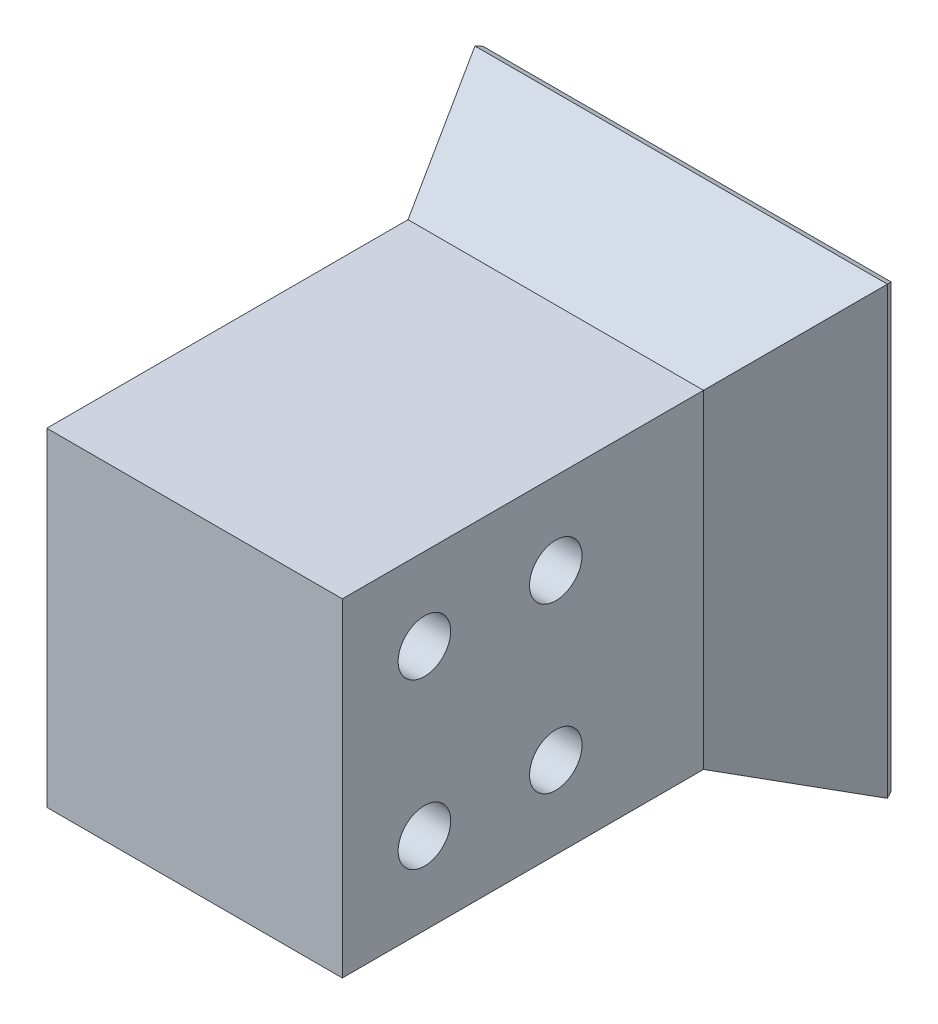
ISO-10303-21;
HEADER;
FILE_DESCRIPTION(('STEP AP214'),'2;1');
FILE_NAME('part.step','',(''),(''),'','','');
FILE_SCHEMA(('AUTOMOTIVE_DESIGN { 1 0 10303 214 1 1 1 1 }'));
ENDSEC;
DATA;
#1=APPLICATION_CONTEXT('core data for automotive mechanical design processes');
#2=APPLICATION_PROTOCOL_DEFINITION('international standard','automotive_design',2000,#1);
#3=PRODUCT_CONTEXT('',#1,'mechanical');
#4=PRODUCT('Part','Part','',(#3));
#5=PRODUCT_RELATED_PRODUCT_CATEGORY('part','',(#4));
#6=PRODUCT_DEFINITION_FORMATION('','',#4);
#7=PRODUCT_DEFINITION_CONTEXT('part definition',#1,'design');
#8=PRODUCT_DEFINITION('design','',#6,#7);
#9=PRODUCT_DEFINITION_SHAPE('','',#8);
#10=(LENGTH_UNIT() NAMED_UNIT(*) SI_UNIT(.MILLI.,.METRE.));
#11=(NAMED_UNIT(*) PLANE_ANGLE_UNIT() SI_UNIT($,.RADIAN.));
#12=(NAMED_UNIT(*) SI_UNIT($,.STERADIAN.) SOLID_ANGLE_UNIT());
#13=UNCERTAINTY_MEASURE_WITH_UNIT(LENGTH_MEASURE(1.E-05),#10,'distance_accuracy_value','');
#14=(GEOMETRIC_REPRESENTATION_CONTEXT(3) GLOBAL_UNCERTAINTY_ASSIGNED_CONTEXT((#13)) GLOBAL_UNIT_ASSIGNED_CONTEXT((#10,
#11,#12)) REPRESENTATION_CONTEXT('',''));
#15=CARTESIAN_POINT('',(0.,0.,0.));
#16=DIRECTION('',(0.,0.,1.));
#17=DIRECTION('',(1.,0.,0.));
#18=AXIS2_PLACEMENT_3D('',#15,#16,#17);
#19=CARTESIAN_POINT('',(9.,10.,22.));
#20=DIRECTION('',(-1.,0.,0.));
#21=DIRECTION('',(0.,0.,1.));
#22=AXIS2_PLACEMENT_3D('',#19,#20,#21);
#23=PLANE('',#22);
#24=CARTESIAN_POINT('',(9.,5.,9.));
#25=DIRECTION('',(1.,0.,0.));
#26=DIRECTION('',(0.,0.,-1.));
#27=AXIS2_PLACEMENT_3D('',#24,#25,#26);
#28=CIRCLE('',#27,1.6);
#29=CARTESIAN_POINT('',(9.,5.,7.4));
#30=VERTEX_POINT('',#29);
#31=EDGE_CURVE('E211',#30,#30,#28,.T.);
#32=ORIENTED_EDGE('',*,*,#31,.F.);
#33=EDGE_LOOP('',(#32));
#34=FACE_BOUND('',#33,.T.);
#35=CARTESIAN_POINT('',(9.,-5.,17.));
#36=DIRECTION('',(1.,0.,0.));
#37=DIRECTION('',(0.,0.,-1.));
#38=AXIS2_PLACEMENT_3D('',#35,#36,#37);
#39=CIRCLE('',#38,1.6);
#40=CARTESIAN_POINT('',(9.,-5.,15.4));
#41=VERTEX_POINT('',#40);
#42=EDGE_CURVE('E208',#41,#41,#39,.T.);
#43=ORIENTED_EDGE('',*,*,#42,.F.);
#44=EDGE_LOOP('',(#43));
#45=FACE_BOUND('',#44,.T.);
#46=CARTESIAN_POINT('',(9.,-5.,9.));
#47=DIRECTION('',(1.,0.,0.));
#48=DIRECTION('',(0.,0.,-1.));
#49=AXIS2_PLACEMENT_3D('',#46,#47,#48);
#50=CIRCLE('',#49,1.6);
#51=CARTESIAN_POINT('',(9.,-5.,7.4));
#52=VERTEX_POINT('',#51);
#53=EDGE_CURVE('E196',#52,#52,#50,.T.);
#54=ORIENTED_EDGE('',*,*,#53,.F.);
#55=EDGE_LOOP('',(#54));
#56=FACE_BOUND('',#55,.T.);
#57=CARTESIAN_POINT('',(9.,5.,17.));
#58=DIRECTION('',(1.,0.,0.));
#59=DIRECTION('',(0.,0.,-1.));
#60=AXIS2_PLACEMENT_3D('',#57,#58,#59);
#61=CIRCLE('',#60,1.6);
#62=CARTESIAN_POINT('',(9.,5.,15.4));
#63=VERTEX_POINT('',#62);
#64=EDGE_CURVE('E220',#63,#63,#61,.T.);
#65=ORIENTED_EDGE('',*,*,#64,.F.);
#66=EDGE_LOOP('',(#65));
#67=FACE_BOUND('',#66,.T.);
#68=DIRECTION('',(0.,1.,0.));
#69=VECTOR('',#68,1.);
#70=CARTESIAN_POINT('',(9.,10.,0.));
#71=LINE('',#70,#69);
#72=CARTESIAN_POINT('',(9.,-10.,0.));
#73=VERTEX_POINT('',#72);
#74=CARTESIAN_POINT('',(9.,10.,0.));
#75=VERTEX_POINT('',#74);
#76=EDGE_CURVE('E109',#73,#75,#71,.T.);
#77=ORIENTED_EDGE('',*,*,#76,.T.);
#78=DIRECTION('',(0.,0.,-1.));
#79=VECTOR('',#78,1.);
#80=CARTESIAN_POINT('',(9.,10.,22.));
#81=LINE('',#80,#79);
#82=CARTESIAN_POINT('',(9.,10.,22.));
#83=VERTEX_POINT('',#82);
#84=EDGE_CURVE('E127',#83,#75,#81,.T.);
#85=ORIENTED_EDGE('',*,*,#84,.F.);
#86=DIRECTION('',(0.,1.,0.));
#87=VECTOR('',#86,1.);
#88=CARTESIAN_POINT('',(9.,10.,22.));
#89=LINE('',#88,#87);
#90=CARTESIAN_POINT('',(9.,-10.,22.));
#91=VERTEX_POINT('',#90);
#92=EDGE_CURVE('E152',#91,#83,#89,.T.);
#93=ORIENTED_EDGE('',*,*,#92,.F.);
#94=DIRECTION('',(0.,0.,-1.));
#95=VECTOR('',#94,1.);
#96=CARTESIAN_POINT('',(9.,-10.,22.));
#97=LINE('',#96,#95);
#98=EDGE_CURVE('E139',#91,#73,#97,.T.);
#99=ORIENTED_EDGE('',*,*,#98,.T.);
#100=EDGE_LOOP('',(#77,#85,#93,#99));
#101=FACE_BOUND('',#100,.T.);
#102=ADVANCED_FACE('F40',(#34,#45,#56,#67,#101),#23,.F.);
#103=CARTESIAN_POINT('',(-9.,10.,22.));
#104=DIRECTION('',(0.,-1.,0.));
#105=DIRECTION('',(0.,0.,-1.));
#106=AXIS2_PLACEMENT_3D('',#103,#104,#105);
#107=PLANE('',#106);
#108=DIRECTION('',(-1.,0.,0.));
#109=VECTOR('',#108,1.);
#110=CARTESIAN_POINT('',(-9.,10.,0.));
#111=LINE('',#110,#109);
#112=CARTESIAN_POINT('',(-9.,10.,0.));
#113=VERTEX_POINT('',#112);
#114=EDGE_CURVE('E115',#75,#113,#111,.T.);
#115=ORIENTED_EDGE('',*,*,#114,.T.);
#116=DIRECTION('',(0.,0.,-1.));
#117=VECTOR('',#116,1.);
#118=CARTESIAN_POINT('',(-9.,10.,22.));
#119=LINE('',#118,#117);
#120=CARTESIAN_POINT('',(-9.,10.,22.));
#121=VERTEX_POINT('',#120);
#122=EDGE_CURVE('E135',#121,#113,#119,.T.);
#123=ORIENTED_EDGE('',*,*,#122,.F.);
#124=DIRECTION('',(-1.,0.,0.));
#125=VECTOR('',#124,1.);
#126=CARTESIAN_POINT('',(-9.,10.,22.));
#127=LINE('',#126,#125);
#128=EDGE_CURVE('E129',#83,#121,#127,.T.);
#129=ORIENTED_EDGE('',*,*,#128,.F.);
#130=ORIENTED_EDGE('',*,*,#84,.T.);
#131=EDGE_LOOP('',(#115,#123,#129,#130));
#132=FACE_BOUND('',#131,.T.);
#133=ADVANCED_FACE('F128',(#132),#107,.F.);
#134=CARTESIAN_POINT('',(-9.,10.,22.));
#135=DIRECTION('',(1.,0.,0.));
#136=DIRECTION('',(0.,1.,0.));
#137=AXIS2_PLACEMENT_3D('',#134,#135,#136);
#138=PLANE('',#137);
#139=CARTESIAN_POINT('',(-9.,5.,9.));
#140=DIRECTION('',(1.,0.,0.));
#141=DIRECTION('',(0.,1.,0.));
#142=AXIS2_PLACEMENT_3D('',#139,#140,#141);
#143=CIRCLE('',#142,1.6);
#144=CARTESIAN_POINT('',(-9.,6.6,9.));
#145=VERTEX_POINT('',#144);
#146=EDGE_CURVE('E215',#145,#145,#143,.F.);
#147=ORIENTED_EDGE('',*,*,#146,.F.);
#148=EDGE_LOOP('',(#147));
#149=FACE_BOUND('',#148,.T.);
#150=CARTESIAN_POINT('',(-9.,-5.,17.));
#151=DIRECTION('',(1.,0.,0.));
#152=DIRECTION('',(0.,1.,0.));
#153=AXIS2_PLACEMENT_3D('',#150,#151,#152);
#154=CIRCLE('',#153,1.6);
#155=CARTESIAN_POINT('',(-9.,-3.4,17.));
#156=VERTEX_POINT('',#155);
#157=EDGE_CURVE('E216',#156,#156,#154,.F.);
#158=ORIENTED_EDGE('',*,*,#157,.F.);
#159=EDGE_LOOP('',(#158));
#160=FACE_BOUND('',#159,.T.);
#161=CARTESIAN_POINT('',(-9.,-5.,9.));
#162=DIRECTION('',(1.,0.,0.));
#163=DIRECTION('',(0.,1.,0.));
#164=AXIS2_PLACEMENT_3D('',#161,#162,#163);
#165=CIRCLE('',#164,1.6);
#166=CARTESIAN_POINT('',(-9.,-3.4,9.));
#167=VERTEX_POINT('',#166);
#168=EDGE_CURVE('E202',#167,#167,#165,.F.);
#169=ORIENTED_EDGE('',*,*,#168,.F.);
#170=EDGE_LOOP('',(#169));
#171=FACE_BOUND('',#170,.T.);
#172=CARTESIAN_POINT('',(-9.,5.,17.));
#173=DIRECTION('',(1.,0.,0.));
#174=DIRECTION('',(0.,1.,0.));
#175=AXIS2_PLACEMENT_3D('',#172,#173,#174);
#176=CIRCLE('',#175,1.6);
#177=CARTESIAN_POINT('',(-9.,6.6,17.));
#178=VERTEX_POINT('',#177);
#179=EDGE_CURVE('E230',#178,#178,#176,.F.);
#180=ORIENTED_EDGE('',*,*,#179,.F.);
#181=EDGE_LOOP('',(#180));
#182=FACE_BOUND('',#181,.T.);
#183=DIRECTION('',(0.,-1.,0.));
#184=VECTOR('',#183,1.);
#185=CARTESIAN_POINT('',(-9.,10.,0.));
#186=LINE('',#185,#184);
#187=CARTESIAN_POINT('',(-9.,-10.,0.));
#188=VERTEX_POINT('',#187);
#189=EDGE_CURVE('E124',#113,#188,#186,.T.);
#190=ORIENTED_EDGE('',*,*,#189,.T.);
#191=DIRECTION('',(0.,0.,-1.));
#192=VECTOR('',#191,1.);
#193=CARTESIAN_POINT('',(-9.,-10.,22.));
#194=LINE('',#193,#192);
#195=CARTESIAN_POINT('',(-9.,-10.,22.));
#196=VERTEX_POINT('',#195);
#197=EDGE_CURVE('E155',#196,#188,#194,.T.);
#198=ORIENTED_EDGE('',*,*,#197,.F.);
#199=DIRECTION('',(0.,-1.,0.));
#200=VECTOR('',#199,1.);
#201=CARTESIAN_POINT('',(-9.,10.,22.));
#202=LINE('',#201,#200);
#203=EDGE_CURVE('E244',#121,#196,#202,.T.);
#204=ORIENTED_EDGE('',*,*,#203,.F.);
#205=ORIENTED_EDGE('',*,*,#122,.T.);
#206=EDGE_LOOP('',(#190,#198,#204,#205));
#207=FACE_BOUND('',#206,.T.);
#208=ADVANCED_FACE('F260',(#149,#160,#171,#182,#207),#138,.F.);
#209=CARTESIAN_POINT('',(-9.,-10.,22.));
#210=DIRECTION('',(0.,1.,0.));
#211=DIRECTION('',(0.,0.,1.));
#212=AXIS2_PLACEMENT_3D('',#209,#210,#211);
#213=PLANE('',#212);
#214=DIRECTION('',(1.,0.,0.));
#215=VECTOR('',#214,1.);
#216=CARTESIAN_POINT('',(-9.,-10.,0.));
#217=LINE('',#216,#215);
#218=EDGE_CURVE('E149',#188,#73,#217,.T.);
#219=ORIENTED_EDGE('',*,*,#218,.T.);
#220=ORIENTED_EDGE('',*,*,#98,.F.);
#221=DIRECTION('',(1.,0.,0.));
#222=VECTOR('',#221,1.);
#223=CARTESIAN_POINT('',(-9.,-10.,22.));
#224=LINE('',#223,#222);
#225=EDGE_CURVE('E143',#196,#91,#224,.T.);
#226=ORIENTED_EDGE('',*,*,#225,.F.);
#227=ORIENTED_EDGE('',*,*,#197,.T.);
#228=EDGE_LOOP('',(#219,#220,#226,#227));
#229=FACE_BOUND('',#228,.T.);
#230=ADVANCED_FACE('F253',(#229),#213,.F.);
#231=CARTESIAN_POINT('',(0.,0.,22.));
#232=DIRECTION('',(0.,0.,1.));
#233=DIRECTION('',(1.,0.,0.));
#234=AXIS2_PLACEMENT_3D('',#231,#232,#233);
#235=PLANE('',#234);
#236=ORIENTED_EDGE('',*,*,#92,.T.);
#237=ORIENTED_EDGE('',*,*,#128,.T.);
#238=ORIENTED_EDGE('',*,*,#203,.T.);
#239=ORIENTED_EDGE('',*,*,#225,.T.);
#240=EDGE_LOOP('',(#236,#237,#238,#239));
#241=FACE_BOUND('',#240,.T.);
#242=ADVANCED_FACE('F251',(#241),#235,.T.);
#243=CARTESIAN_POINT('',(-9.,10.,0.));
#244=DIRECTION('',(0.,0.90630778703665,0.4226182617407));
#245=DIRECTION('',(0.,-0.4226182617407,0.90630778703665));
#246=AXIS2_PLACEMENT_3D('',#243,#244,#245);
#247=PLANE('',#246);
#248=DIRECTION('',(-0.389281620635026,-0.389281620635026,0.834817129478987));
#249=VECTOR('',#248,1.);
#250=CARTESIAN_POINT('',(9.,10.,0.));
#251=LINE('',#250,#249);
#252=CARTESIAN_POINT('',(12.5614139605437,13.5614139605437,-7.63747688518534));
#253=VERTEX_POINT('',#252);
#254=EDGE_CURVE('E105',#253,#75,#251,.T.);
#255=ORIENTED_EDGE('',*,*,#254,.F.);
#256=DIRECTION('',(1.,0.,0.));
#257=VECTOR('',#256,1.);
#258=CARTESIAN_POINT('',(-12.73046126524,13.5614139605437,-7.63747688518534));
#259=LINE('',#258,#257);
#260=CARTESIAN_POINT('',(-12.5614139605437,13.5614139605437,-7.63747688518534));
#261=VERTEX_POINT('',#260);
#262=EDGE_CURVE('E51',#253,#261,#259,.F.);
#263=ORIENTED_EDGE('',*,*,#262,.T.);
#264=DIRECTION('',(0.389281620635026,-0.389281620635026,0.834817129478987));
#265=VECTOR('',#264,1.);
#266=CARTESIAN_POINT('',(-9.,10.,0.));
#267=LINE('',#266,#265);
#268=EDGE_CURVE('E118',#261,#113,#267,.T.);
#269=ORIENTED_EDGE('',*,*,#268,.T.);
#270=ORIENTED_EDGE('',*,*,#114,.F.);
#271=EDGE_LOOP('',(#255,#263,#269,#270));
#272=FACE_BOUND('',#271,.T.);
#273=ADVANCED_FACE('F117',(#272),#247,.T.);
#274=CARTESIAN_POINT('',(9.,10.,0.));
#275=DIRECTION('',(0.90630778703665,0.,0.4226182617407));
#276=DIRECTION('',(0.4226182617407,0.,-0.90630778703665));
#277=AXIS2_PLACEMENT_3D('',#274,#275,#276);
#278=PLANE('',#277);
#279=DIRECTION('',(-0.389281620635026,0.389281620635026,0.834817129478987));
#280=VECTOR('',#279,1.);
#281=CARTESIAN_POINT('',(9.,-10.,0.));
#282=LINE('',#281,#280);
#283=CARTESIAN_POINT('',(12.5614139605437,-13.5614139605437,-7.63747688518534));
#284=VERTEX_POINT('',#283);
#285=EDGE_CURVE('E112',#284,#73,#282,.T.);
#286=ORIENTED_EDGE('',*,*,#285,.F.);
#287=DIRECTION('',(0.,-1.,0.));
#288=VECTOR('',#287,1.);
#289=CARTESIAN_POINT('',(12.5614139605437,13.73046126524,-7.63747688518534));
#290=LINE('',#289,#288);
#291=EDGE_CURVE('E11',#284,#253,#290,.F.);
#292=ORIENTED_EDGE('',*,*,#291,.T.);
#293=ORIENTED_EDGE('',*,*,#254,.T.);
#294=ORIENTED_EDGE('',*,*,#76,.F.);
#295=EDGE_LOOP('',(#286,#292,#293,#294));
#296=FACE_BOUND('',#295,.T.);
#297=ADVANCED_FACE('F107',(#296),#278,.T.);
#298=CARTESIAN_POINT('',(9.,-10.,0.));
#299=DIRECTION('',(0.,-0.90630778703665,0.4226182617407));
#300=DIRECTION('',(0.,-0.4226182617407,-0.90630778703665));
#301=AXIS2_PLACEMENT_3D('',#298,#299,#300);
#302=PLANE('',#301);
#303=DIRECTION('',(0.389281620635026,0.389281620635026,0.834817129478987));
#304=VECTOR('',#303,1.);
#305=CARTESIAN_POINT('',(-9.,-10.,0.));
#306=LINE('',#305,#304);
#307=CARTESIAN_POINT('',(-12.5614139605437,-13.5614139605437,-7.63747688518534));
#308=VERTEX_POINT('',#307);
#309=EDGE_CURVE('E236',#308,#188,#306,.T.);
#310=ORIENTED_EDGE('',*,*,#309,.F.);
#311=DIRECTION('',(-1.,0.,0.));
#312=VECTOR('',#311,1.);
#313=CARTESIAN_POINT('',(12.73046126524,-13.5614139605437,-7.63747688518534));
#314=LINE('',#313,#312);
#315=EDGE_CURVE('E173',#308,#284,#314,.F.);
#316=ORIENTED_EDGE('',*,*,#315,.T.);
#317=ORIENTED_EDGE('',*,*,#285,.T.);
#318=ORIENTED_EDGE('',*,*,#218,.F.);
#319=EDGE_LOOP('',(#310,#316,#317,#318));
#320=FACE_BOUND('',#319,.T.);
#321=ADVANCED_FACE('F257',(#320),#302,.T.);
#322=CARTESIAN_POINT('',(-9.,-10.,0.));
#323=DIRECTION('',(-0.90630778703665,0.,0.4226182617407));
#324=DIRECTION('',(0.4226182617407,0.,0.90630778703665));
#325=AXIS2_PLACEMENT_3D('',#322,#323,#324);
#326=PLANE('',#325);
#327=ORIENTED_EDGE('',*,*,#268,.F.);
#328=DIRECTION('',(0.,1.,0.));
#329=VECTOR('',#328,1.);
#330=CARTESIAN_POINT('',(-12.5614139605437,-13.73046126524,-7.63747688518534));
#331=LINE('',#330,#329);
#332=EDGE_CURVE('E177',#261,#308,#331,.F.);
#333=ORIENTED_EDGE('',*,*,#332,.T.);
#334=ORIENTED_EDGE('',*,*,#309,.T.);
#335=ORIENTED_EDGE('',*,*,#189,.F.);
#336=EDGE_LOOP('',(#327,#333,#334,#335));
#337=FACE_BOUND('',#336,.T.);
#338=ADVANCED_FACE('F262',(#337),#326,.T.);
#339=CARTESIAN_POINT('',(0.,0.,-8.));
#340=DIRECTION('',(0.,0.,-1.));
#341=DIRECTION('',(-1.,0.,0.));
#342=AXIS2_PLACEMENT_3D('',#339,#340,#341);
#343=PLANE('',#342);
#344=DIRECTION('',(0.,-1.,0.));
#345=VECTOR('',#344,1.);
#346=CARTESIAN_POINT('',(12.4294663375177,-13.73046126524,-8.));
#347=LINE('',#346,#345);
#348=CARTESIAN_POINT('',(12.4294663375177,13.4294663375177,-8.));
#349=VERTEX_POINT('',#348);
#350=CARTESIAN_POINT('',(12.4294663375177,-13.4294663375177,-8.));
#351=VERTEX_POINT('',#350);
#352=EDGE_CURVE('E134',#349,#351,#347,.T.);
#353=ORIENTED_EDGE('',*,*,#352,.T.);
#354=DIRECTION('',(-1.,0.,0.));
#355=VECTOR('',#354,1.);
#356=CARTESIAN_POINT('',(-12.73046126524,-13.4294663375177,-8.));
#357=LINE('',#356,#355);
#358=CARTESIAN_POINT('',(-12.4294663375177,-13.4294663375177,-8.));
#359=VERTEX_POINT('',#358);
#360=EDGE_CURVE('E169',#351,#359,#357,.T.);
#361=ORIENTED_EDGE('',*,*,#360,.T.);
#362=DIRECTION('',(0.,1.,0.));
#363=VECTOR('',#362,1.);
#364=CARTESIAN_POINT('',(-12.4294663375177,13.73046126524,-8.));
#365=LINE('',#364,#363);
#366=CARTESIAN_POINT('',(-12.4294663375177,13.4294663375177,-8.));
#367=VERTEX_POINT('',#366);
#368=EDGE_CURVE('E166',#359,#367,#365,.T.);
#369=ORIENTED_EDGE('',*,*,#368,.T.);
#370=DIRECTION('',(1.,0.,0.));
#371=VECTOR('',#370,1.);
#372=CARTESIAN_POINT('',(12.73046126524,13.4294663375177,-8.));
#373=LINE('',#372,#371);
#374=EDGE_CURVE('E163',#367,#349,#373,.T.);
#375=ORIENTED_EDGE('',*,*,#374,.T.);
#376=EDGE_LOOP('',(#353,#361,#369,#375));
#377=FACE_BOUND('',#376,.T.);
#378=ADVANCED_FACE('F324',(#377),#343,.T.);
#379=CARTESIAN_POINT('',(-13.5254833995939,5.,17.));
#380=DIRECTION('',(1.,0.,0.));
#381=DIRECTION('',(0.,0.,-1.));
#382=AXIS2_PLACEMENT_3D('',#379,#380,#381);
#383=CYLINDRICAL_SURFACE('',#382,1.6);
#384=ORIENTED_EDGE('',*,*,#179,.T.);
#385=EDGE_LOOP('',(#384));
#386=FACE_BOUND('',#385,.T.);
#387=ORIENTED_EDGE('',*,*,#64,.T.);
#388=EDGE_LOOP('',(#387));
#389=FACE_BOUND('',#388,.T.);
#390=ADVANCED_FACE('F328',(#386,#389),#383,.F.);
#391=CARTESIAN_POINT('',(-13.5254833995939,-5.,9.));
#392=DIRECTION('',(1.,0.,0.));
#393=DIRECTION('',(0.,0.,-1.));
#394=AXIS2_PLACEMENT_3D('',#391,#392,#393);
#395=CYLINDRICAL_SURFACE('',#394,1.6);
#396=ORIENTED_EDGE('',*,*,#168,.T.);
#397=EDGE_LOOP('',(#396));
#398=FACE_BOUND('',#397,.T.);
#399=ORIENTED_EDGE('',*,*,#53,.T.);
#400=EDGE_LOOP('',(#399));
#401=FACE_BOUND('',#400,.T.);
#402=ADVANCED_FACE('F371',(#398,#401),#395,.F.);
#403=CARTESIAN_POINT('',(-13.5254833995939,-5.,17.));
#404=DIRECTION('',(1.,0.,0.));
#405=DIRECTION('',(0.,0.,-1.));
#406=AXIS2_PLACEMENT_3D('',#403,#404,#405);
#407=CYLINDRICAL_SURFACE('',#406,1.6);
#408=ORIENTED_EDGE('',*,*,#157,.T.);
#409=EDGE_LOOP('',(#408));
#410=FACE_BOUND('',#409,.T.);
#411=ORIENTED_EDGE('',*,*,#42,.T.);
#412=EDGE_LOOP('',(#411));
#413=FACE_BOUND('',#412,.T.);
#414=ADVANCED_FACE('F361',(#410,#413),#407,.F.);
#415=CARTESIAN_POINT('',(-13.5254833995939,5.,9.));
#416=DIRECTION('',(1.,0.,0.));
#417=DIRECTION('',(0.,0.,-1.));
#418=AXIS2_PLACEMENT_3D('',#415,#416,#417);
#419=CYLINDRICAL_SURFACE('',#418,1.6);
#420=ORIENTED_EDGE('',*,*,#146,.T.);
#421=EDGE_LOOP('',(#420));
#422=FACE_BOUND('',#421,.T.);
#423=ORIENTED_EDGE('',*,*,#31,.T.);
#424=EDGE_LOOP('',(#423));
#425=FACE_BOUND('',#424,.T.);
#426=ADVANCED_FACE('F276',(#422,#425),#419,.F.);
#427=CARTESIAN_POINT('',(0.,13.4294663375177,-8.));
#428=DIRECTION('',(0.,-0.939692620785909,0.342020143325667));
#429=DIRECTION('',(1.,0.,0.));
#430=AXIS2_PLACEMENT_3D('',#427,#428,#429);
#431=PLANE('',#430);
#432=DIRECTION('',(-0.323615577118191,0.323615577118182,0.889126490715987));
#433=VECTOR('',#432,1.);
#434=CARTESIAN_POINT('',(-11.1277650974143,12.1277650974143,-11.5763947640602));
#435=LINE('',#434,#433);
#436=EDGE_CURVE('E187',#261,#367,#435,.F.);
#437=ORIENTED_EDGE('',*,*,#436,.F.);
#438=ORIENTED_EDGE('',*,*,#262,.F.);
#439=DIRECTION('',(0.323615577118187,0.323615577118182,0.889126490715988));
#440=VECTOR('',#439,1.);
#441=CARTESIAN_POINT('',(11.0230380556608,12.0230380556608,-11.8641299464842));
#442=LINE('',#441,#440);
#443=EDGE_CURVE('E45',#349,#253,#442,.T.);
#444=ORIENTED_EDGE('',*,*,#443,.F.);
#445=ORIENTED_EDGE('',*,*,#374,.F.);
#446=EDGE_LOOP('',(#437,#438,#444,#445));
#447=FACE_BOUND('',#446,.T.);
#448=ADVANCED_FACE('F43',(#447),#431,.F.);
#449=CARTESIAN_POINT('',(12.4294663375177,0.,-8.));
#450=DIRECTION('',(-0.939692620785908,0.,0.342020143325671));
#451=DIRECTION('',(0.,-1.,0.));
#452=AXIS2_PLACEMENT_3D('',#449,#450,#451);
#453=PLANE('',#452);
#454=ORIENTED_EDGE('',*,*,#443,.T.);
#455=ORIENTED_EDGE('',*,*,#291,.F.);
#456=DIRECTION('',(-0.323615577118187,0.323615577118182,-0.889126490715988));
#457=VECTOR('',#456,1.);
#458=CARTESIAN_POINT('',(11.0230380556608,-12.0230380556608,-11.8641299464842));
#459=LINE('',#458,#457);
#460=EDGE_CURVE('E185',#351,#284,#459,.F.);
#461=ORIENTED_EDGE('',*,*,#460,.F.);
#462=ORIENTED_EDGE('',*,*,#352,.F.);
#463=EDGE_LOOP('',(#454,#455,#461,#462));
#464=FACE_BOUND('',#463,.T.);
#465=ADVANCED_FACE('F269',(#464),#453,.F.);
#466=CARTESIAN_POINT('',(-12.4294663375177,0.,-8.));
#467=DIRECTION('',(0.939692620785906,0.,0.342020143325674));
#468=DIRECTION('',(0.,1.,0.));
#469=AXIS2_PLACEMENT_3D('',#466,#467,#468);
#470=PLANE('',#469);
#471=ORIENTED_EDGE('',*,*,#436,.T.);
#472=ORIENTED_EDGE('',*,*,#368,.F.);
#473=DIRECTION('',(-0.32361557711819,-0.323615577118182,0.889126490715987));
#474=VECTOR('',#473,1.);
#475=CARTESIAN_POINT('',(-11.0230380556608,-12.0230380556608,-11.8641299464842));
#476=LINE('',#475,#474);
#477=EDGE_CURVE('E182',#308,#359,#476,.F.);
#478=ORIENTED_EDGE('',*,*,#477,.F.);
#479=ORIENTED_EDGE('',*,*,#332,.F.);
#480=EDGE_LOOP('',(#471,#472,#478,#479));
#481=FACE_BOUND('',#480,.T.);
#482=ADVANCED_FACE('F264',(#481),#470,.F.);
#483=CARTESIAN_POINT('',(0.,-13.4294663375177,-8.));
#484=DIRECTION('',(0.,0.939692620785909,0.342020143325667));
#485=DIRECTION('',(-1.,0.,0.));
#486=AXIS2_PLACEMENT_3D('',#483,#484,#485);
#487=PLANE('',#486);
#488=ORIENTED_EDGE('',*,*,#460,.T.);
#489=ORIENTED_EDGE('',*,*,#315,.F.);
#490=ORIENTED_EDGE('',*,*,#477,.T.);
#491=ORIENTED_EDGE('',*,*,#360,.F.);
#492=EDGE_LOOP('',(#488,#489,#490,#491));
#493=FACE_BOUND('',#492,.T.);
#494=ADVANCED_FACE('F267',(#493),#487,.F.);
#495=CLOSED_SHELL('',(#102,#133,#208,#230,#242,#273,#297,#321,#338,#378,#390,#402,#414,#426,
#448,#465,#482,#494));
#496=MANIFOLD_SOLID_BREP('B2',#495);
#497=ADVANCED_BREP_SHAPE_REPRESENTATION('',(#18,#496),#14);
#498=SHAPE_DEFINITION_REPRESENTATION(#9,#497);
ENDSEC;
END-ISO-10303-21;
